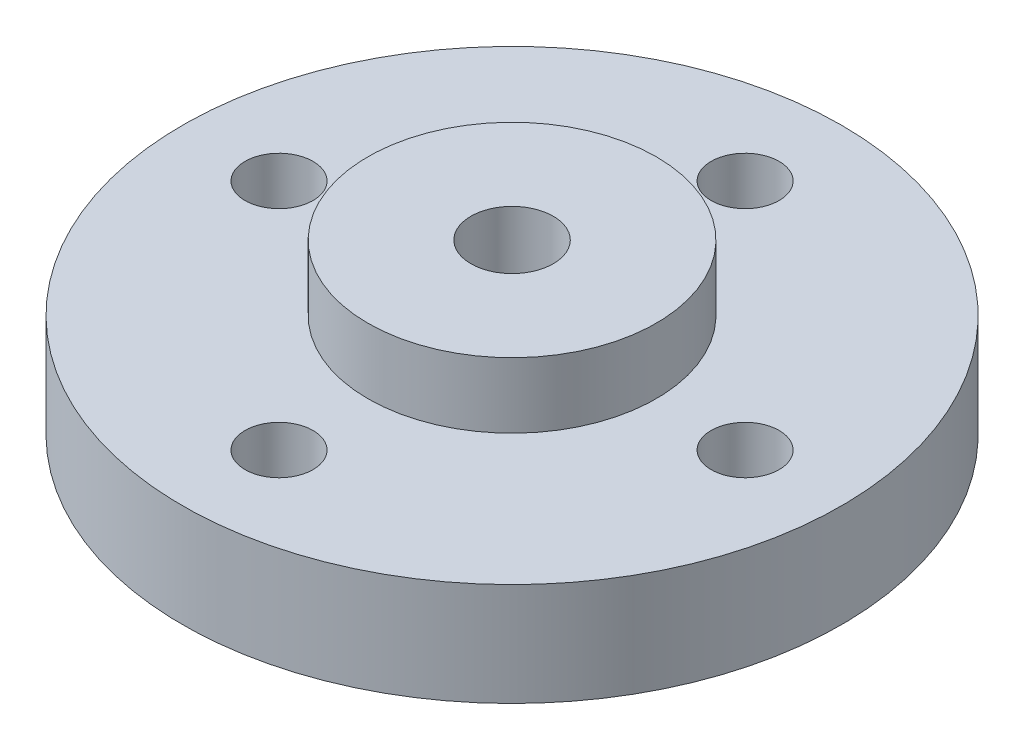
ISO-10303-21;
HEADER;
FILE_DESCRIPTION(('STEP AP214'),'2;1');
FILE_NAME('part.step','',(''),(''),'','','');
FILE_SCHEMA(('AUTOMOTIVE_DESIGN { 1 0 10303 214 1 1 1 1 }'));
ENDSEC;
DATA;
#1=APPLICATION_CONTEXT('core data for automotive mechanical design processes');
#2=APPLICATION_PROTOCOL_DEFINITION('international standard','automotive_design',2000,#1);
#3=PRODUCT_CONTEXT('',#1,'mechanical');
#4=PRODUCT('Part','Part','',(#3));
#5=PRODUCT_RELATED_PRODUCT_CATEGORY('part','',(#4));
#6=PRODUCT_DEFINITION_FORMATION('','',#4);
#7=PRODUCT_DEFINITION_CONTEXT('part definition',#1,'design');
#8=PRODUCT_DEFINITION('design','',#6,#7);
#9=PRODUCT_DEFINITION_SHAPE('','',#8);
#10=(LENGTH_UNIT() NAMED_UNIT(*) SI_UNIT(.MILLI.,.METRE.));
#11=(NAMED_UNIT(*) PLANE_ANGLE_UNIT() SI_UNIT($,.RADIAN.));
#12=(NAMED_UNIT(*) SI_UNIT($,.STERADIAN.) SOLID_ANGLE_UNIT());
#13=UNCERTAINTY_MEASURE_WITH_UNIT(LENGTH_MEASURE(1.E-05),#10,'distance_accuracy_value','');
#14=(GEOMETRIC_REPRESENTATION_CONTEXT(3) GLOBAL_UNCERTAINTY_ASSIGNED_CONTEXT((#13)) GLOBAL_UNIT_ASSIGNED_CONTEXT((#10,
#11,#12)) REPRESENTATION_CONTEXT('',''));
#15=CARTESIAN_POINT('',(0.,0.,0.));
#16=DIRECTION('',(0.,0.,1.));
#17=DIRECTION('',(1.,0.,0.));
#18=AXIS2_PLACEMENT_3D('',#15,#16,#17);
#19=CARTESIAN_POINT('',(-2.93582611882925,-5.,1.695));
#20=DIRECTION('',(0.866025403784439,0.,-0.5));
#21=DIRECTION('',(-0.5,0.,-0.866025403784439));
#22=AXIS2_PLACEMENT_3D('',#19,#20,#21);
#23=PLANE('',#22);
#24=DIRECTION('',(-0.5,0.,-0.866025403784439));
#25=VECTOR('',#24,1.);
#26=CARTESIAN_POINT('',(-2.93582611882925,0.,1.695));
#27=LINE('',#26,#25);
#28=CARTESIAN_POINT('',(-1.95721741255283,0.,3.39));
#29=VERTEX_POINT('',#28);
#30=CARTESIAN_POINT('',(-3.91443482510567,0.,0.));
#31=VERTEX_POINT('',#30);
#32=EDGE_CURVE('E138',#29,#31,#27,.T.);
#33=ORIENTED_EDGE('',*,*,#32,.F.);
#34=DIRECTION('',(0.,1.,0.));
#35=VECTOR('',#34,1.);
#36=CARTESIAN_POINT('',(-1.95721741255283,-5.,3.39));
#37=LINE('',#36,#35);
#38=CARTESIAN_POINT('',(-1.95721741255283,-5.,3.39));
#39=VERTEX_POINT('',#38);
#40=EDGE_CURVE('E12',#39,#29,#37,.T.);
#41=ORIENTED_EDGE('',*,*,#40,.F.);
#42=DIRECTION('',(-0.5,0.,-0.866025403784439));
#43=VECTOR('',#42,1.);
#44=CARTESIAN_POINT('',(-2.93582611882925,-5.,1.695));
#45=LINE('',#44,#43);
#46=CARTESIAN_POINT('',(-3.91443482510567,-5.,0.));
#47=VERTEX_POINT('',#46);
#48=EDGE_CURVE('E321',#39,#47,#45,.T.);
#49=ORIENTED_EDGE('',*,*,#48,.T.);
#50=DIRECTION('',(0.,1.,0.));
#51=VECTOR('',#50,1.);
#52=CARTESIAN_POINT('',(-3.91443482510567,-5.,0.));
#53=LINE('',#52,#51);
#54=EDGE_CURVE('E58',#47,#31,#53,.T.);
#55=ORIENTED_EDGE('',*,*,#54,.T.);
#56=EDGE_LOOP('',(#33,#41,#49,#55));
#57=FACE_BOUND('',#56,.T.);
#58=ADVANCED_FACE('F41',(#57),#23,.T.);
#59=CARTESIAN_POINT('',(0.,-5.,3.39));
#60=DIRECTION('',(0.,0.,-1.));
#61=DIRECTION('',(-1.,0.,0.));
#62=AXIS2_PLACEMENT_3D('',#59,#60,#61);
#63=PLANE('',#62);
#64=DIRECTION('',(-1.,0.,0.));
#65=VECTOR('',#64,1.);
#66=CARTESIAN_POINT('',(0.,0.,3.39));
#67=LINE('',#66,#65);
#68=CARTESIAN_POINT('',(1.95721741255283,0.,3.39));
#69=VERTEX_POINT('',#68);
#70=EDGE_CURVE('E140',#69,#29,#67,.T.);
#71=ORIENTED_EDGE('',*,*,#70,.F.);
#72=DIRECTION('',(0.,1.,0.));
#73=VECTOR('',#72,1.);
#74=CARTESIAN_POINT('',(1.95721741255283,-5.,3.39));
#75=LINE('',#74,#73);
#76=CARTESIAN_POINT('',(1.95721741255283,-5.,3.39));
#77=VERTEX_POINT('',#76);
#78=EDGE_CURVE('E50',#77,#69,#75,.T.);
#79=ORIENTED_EDGE('',*,*,#78,.F.);
#80=DIRECTION('',(-1.,0.,0.));
#81=VECTOR('',#80,1.);
#82=CARTESIAN_POINT('',(0.,-5.,3.39));
#83=LINE('',#82,#81);
#84=EDGE_CURVE('E323',#77,#39,#83,.T.);
#85=ORIENTED_EDGE('',*,*,#84,.T.);
#86=ORIENTED_EDGE('',*,*,#40,.T.);
#87=EDGE_LOOP('',(#71,#79,#85,#86));
#88=FACE_BOUND('',#87,.T.);
#89=ADVANCED_FACE('F161',(#88),#63,.T.);
#90=CARTESIAN_POINT('',(2.93582611882925,-5.,1.695));
#91=DIRECTION('',(-0.866025403784438,0.,-0.5));
#92=DIRECTION('',(-0.5,0.,0.866025403784438));
#93=AXIS2_PLACEMENT_3D('',#90,#91,#92);
#94=PLANE('',#93);
#95=DIRECTION('',(-0.5,0.,0.866025403784439));
#96=VECTOR('',#95,1.);
#97=CARTESIAN_POINT('',(2.93582611882925,0.,1.695));
#98=LINE('',#97,#96);
#99=CARTESIAN_POINT('',(3.91443482510567,0.,0.));
#100=VERTEX_POINT('',#99);
#101=EDGE_CURVE('E143',#100,#69,#98,.T.);
#102=ORIENTED_EDGE('',*,*,#101,.F.);
#103=DIRECTION('',(0.,1.,0.));
#104=VECTOR('',#103,1.);
#105=CARTESIAN_POINT('',(3.91443482510567,-5.,0.));
#106=LINE('',#105,#104);
#107=CARTESIAN_POINT('',(3.91443482510567,-5.,0.));
#108=VERTEX_POINT('',#107);
#109=EDGE_CURVE('E105',#108,#100,#106,.T.);
#110=ORIENTED_EDGE('',*,*,#109,.F.);
#111=DIRECTION('',(-0.5,0.,0.866025403784439));
#112=VECTOR('',#111,1.);
#113=CARTESIAN_POINT('',(2.93582611882925,-5.,1.695));
#114=LINE('',#113,#112);
#115=EDGE_CURVE('E115',#108,#77,#114,.T.);
#116=ORIENTED_EDGE('',*,*,#115,.T.);
#117=ORIENTED_EDGE('',*,*,#78,.T.);
#118=EDGE_LOOP('',(#102,#110,#116,#117));
#119=FACE_BOUND('',#118,.T.);
#120=ADVANCED_FACE('F158',(#119),#94,.T.);
#121=CARTESIAN_POINT('',(2.93582611882925,-5.,-1.695));
#122=DIRECTION('',(-0.866025403784439,0.,0.5));
#123=DIRECTION('',(0.5,0.,0.866025403784439));
#124=AXIS2_PLACEMENT_3D('',#121,#122,#123);
#125=PLANE('',#124);
#126=DIRECTION('',(0.5,0.,0.866025403784439));
#127=VECTOR('',#126,1.);
#128=CARTESIAN_POINT('',(2.93582611882925,0.,-1.695));
#129=LINE('',#128,#127);
#130=CARTESIAN_POINT('',(1.95721741255283,0.,-3.39));
#131=VERTEX_POINT('',#130);
#132=EDGE_CURVE('E101',#131,#100,#129,.T.);
#133=ORIENTED_EDGE('',*,*,#132,.F.);
#134=DIRECTION('',(0.,1.,0.));
#135=VECTOR('',#134,1.);
#136=CARTESIAN_POINT('',(1.95721741255283,-5.,-3.39));
#137=LINE('',#136,#135);
#138=CARTESIAN_POINT('',(1.95721741255283,-5.,-3.39));
#139=VERTEX_POINT('',#138);
#140=EDGE_CURVE('E96',#139,#131,#137,.T.);
#141=ORIENTED_EDGE('',*,*,#140,.F.);
#142=DIRECTION('',(0.5,0.,0.866025403784439));
#143=VECTOR('',#142,1.);
#144=CARTESIAN_POINT('',(2.93582611882925,-5.,-1.695));
#145=LINE('',#144,#143);
#146=EDGE_CURVE('E99',#139,#108,#145,.T.);
#147=ORIENTED_EDGE('',*,*,#146,.T.);
#148=ORIENTED_EDGE('',*,*,#109,.T.);
#149=EDGE_LOOP('',(#133,#141,#147,#148));
#150=FACE_BOUND('',#149,.T.);
#151=ADVANCED_FACE('F98',(#150),#125,.T.);
#152=CARTESIAN_POINT('',(0.,-5.,-3.39));
#153=DIRECTION('',(0.,0.,1.));
#154=DIRECTION('',(1.,0.,0.));
#155=AXIS2_PLACEMENT_3D('',#152,#153,#154);
#156=PLANE('',#155);
#157=DIRECTION('',(1.,0.,0.));
#158=VECTOR('',#157,1.);
#159=CARTESIAN_POINT('',(0.,0.,-3.39));
#160=LINE('',#159,#158);
#161=CARTESIAN_POINT('',(-1.95721741255283,0.,-3.39));
#162=VERTEX_POINT('',#161);
#163=EDGE_CURVE('E147',#162,#131,#160,.T.);
#164=ORIENTED_EDGE('',*,*,#163,.F.);
#165=DIRECTION('',(0.,1.,0.));
#166=VECTOR('',#165,1.);
#167=CARTESIAN_POINT('',(-1.95721741255283,-5.,-3.39));
#168=LINE('',#167,#166);
#169=CARTESIAN_POINT('',(-1.95721741255283,-5.,-3.39));
#170=VERTEX_POINT('',#169);
#171=EDGE_CURVE('E77',#170,#162,#168,.T.);
#172=ORIENTED_EDGE('',*,*,#171,.F.);
#173=DIRECTION('',(1.,0.,0.));
#174=VECTOR('',#173,1.);
#175=CARTESIAN_POINT('',(0.,-5.,-3.39));
#176=LINE('',#175,#174);
#177=EDGE_CURVE('E112',#170,#139,#176,.T.);
#178=ORIENTED_EDGE('',*,*,#177,.T.);
#179=ORIENTED_EDGE('',*,*,#140,.T.);
#180=EDGE_LOOP('',(#164,#172,#178,#179));
#181=FACE_BOUND('',#180,.T.);
#182=ADVANCED_FACE('F117',(#181),#156,.T.);
#183=CARTESIAN_POINT('',(0.,-5.,0.));
#184=DIRECTION('',(0.,1.,0.));
#185=DIRECTION('',(0.,0.,1.));
#186=AXIS2_PLACEMENT_3D('',#183,#184,#185);
#187=CYLINDRICAL_SURFACE('',#186,16.);
#188=CARTESIAN_POINT('',(0.,-5.,0.));
#189=DIRECTION('',(0.,-1.,0.));
#190=DIRECTION('',(0.,0.,-1.));
#191=AXIS2_PLACEMENT_3D('',#188,#189,#190);
#192=CIRCLE('',#191,16.);
#193=CARTESIAN_POINT('',(0.,-5.,-16.));
#194=VERTEX_POINT('',#193);
#195=EDGE_CURVE('E318',#194,#194,#192,.T.);
#196=ORIENTED_EDGE('',*,*,#195,.F.);
#197=EDGE_LOOP('',(#196));
#198=FACE_BOUND('',#197,.T.);
#199=CARTESIAN_POINT('',(0.,0.,0.));
#200=DIRECTION('',(0.,-1.,0.));
#201=DIRECTION('',(0.,0.,-1.));
#202=AXIS2_PLACEMENT_3D('',#199,#200,#201);
#203=CIRCLE('',#202,16.);
#204=CARTESIAN_POINT('',(0.,0.,-16.));
#205=VERTEX_POINT('',#204);
#206=EDGE_CURVE('E135',#205,#205,#203,.T.);
#207=ORIENTED_EDGE('',*,*,#206,.T.);
#208=EDGE_LOOP('',(#207));
#209=FACE_BOUND('',#208,.T.);
#210=ADVANCED_FACE('F185',(#198,#209),#187,.T.);
#211=CARTESIAN_POINT('',(-11.3137084989848,-5.,0.));
#212=DIRECTION('',(0.,1.,0.));
#213=DIRECTION('',(0.,0.,1.));
#214=AXIS2_PLACEMENT_3D('',#211,#212,#213);
#215=CYLINDRICAL_SURFACE('',#214,1.65);
#216=CARTESIAN_POINT('',(-11.3137084989848,-5.,0.));
#217=DIRECTION('',(0.,-1.,0.));
#218=DIRECTION('',(0.,0.,-1.));
#219=AXIS2_PLACEMENT_3D('',#216,#217,#218);
#220=CIRCLE('',#219,1.65);
#221=CARTESIAN_POINT('',(-11.3137084989848,-5.,-1.65));
#222=VERTEX_POINT('',#221);
#223=EDGE_CURVE('E311',#222,#222,#220,.T.);
#224=ORIENTED_EDGE('',*,*,#223,.T.);
#225=EDGE_LOOP('',(#224));
#226=FACE_BOUND('',#225,.T.);
#227=CARTESIAN_POINT('',(-11.3137084989848,0.,0.));
#228=DIRECTION('',(0.,-1.,0.));
#229=DIRECTION('',(0.,0.,-1.));
#230=AXIS2_PLACEMENT_3D('',#227,#228,#229);
#231=CIRCLE('',#230,1.65);
#232=CARTESIAN_POINT('',(-11.3137084989848,0.,-1.65));
#233=VERTEX_POINT('',#232);
#234=EDGE_CURVE('E132',#233,#233,#231,.T.);
#235=ORIENTED_EDGE('',*,*,#234,.F.);
#236=EDGE_LOOP('',(#235));
#237=FACE_BOUND('',#236,.T.);
#238=ADVANCED_FACE('F188',(#226,#237),#215,.F.);
#239=CARTESIAN_POINT('',(0.,-5.,-11.3137084989848));
#240=DIRECTION('',(0.,1.,0.));
#241=DIRECTION('',(0.,0.,1.));
#242=AXIS2_PLACEMENT_3D('',#239,#240,#241);
#243=CYLINDRICAL_SURFACE('',#242,1.65);
#244=CARTESIAN_POINT('',(0.,-5.,-11.3137084989848));
#245=DIRECTION('',(0.,-1.,0.));
#246=DIRECTION('',(0.,0.,-1.));
#247=AXIS2_PLACEMENT_3D('',#244,#245,#246);
#248=CIRCLE('',#247,1.65);
#249=CARTESIAN_POINT('',(0.,-5.,-12.9637084989848));
#250=VERTEX_POINT('',#249);
#251=EDGE_CURVE('E308',#250,#250,#248,.T.);
#252=ORIENTED_EDGE('',*,*,#251,.T.);
#253=EDGE_LOOP('',(#252));
#254=FACE_BOUND('',#253,.T.);
#255=CARTESIAN_POINT('',(0.,0.,-11.3137084989848));
#256=DIRECTION('',(0.,-1.,0.));
#257=DIRECTION('',(0.,0.,-1.));
#258=AXIS2_PLACEMENT_3D('',#255,#256,#257);
#259=CIRCLE('',#258,1.65);
#260=CARTESIAN_POINT('',(0.,0.,-12.9637084989848));
#261=VERTEX_POINT('',#260);
#262=EDGE_CURVE('E129',#261,#261,#259,.T.);
#263=ORIENTED_EDGE('',*,*,#262,.F.);
#264=EDGE_LOOP('',(#263));
#265=FACE_BOUND('',#264,.T.);
#266=ADVANCED_FACE('F192',(#254,#265),#243,.F.);
#267=CARTESIAN_POINT('',(11.3137084989848,-5.,0.));
#268=DIRECTION('',(0.,1.,0.));
#269=DIRECTION('',(0.,0.,1.));
#270=AXIS2_PLACEMENT_3D('',#267,#268,#269);
#271=CYLINDRICAL_SURFACE('',#270,1.65);
#272=CARTESIAN_POINT('',(11.3137084989848,-5.,0.));
#273=DIRECTION('',(0.,-1.,0.));
#274=DIRECTION('',(0.,0.,-1.));
#275=AXIS2_PLACEMENT_3D('',#272,#273,#274);
#276=CIRCLE('',#275,1.65);
#277=CARTESIAN_POINT('',(11.3137084989848,-5.,-1.65));
#278=VERTEX_POINT('',#277);
#279=EDGE_CURVE('E203',#278,#278,#276,.T.);
#280=ORIENTED_EDGE('',*,*,#279,.T.);
#281=EDGE_LOOP('',(#280));
#282=FACE_BOUND('',#281,.T.);
#283=CARTESIAN_POINT('',(11.3137084989848,0.,0.));
#284=DIRECTION('',(0.,-1.,0.));
#285=DIRECTION('',(0.,0.,-1.));
#286=AXIS2_PLACEMENT_3D('',#283,#284,#285);
#287=CIRCLE('',#286,1.65);
#288=CARTESIAN_POINT('',(11.3137084989848,0.,-1.65));
#289=VERTEX_POINT('',#288);
#290=EDGE_CURVE('E126',#289,#289,#287,.T.);
#291=ORIENTED_EDGE('',*,*,#290,.F.);
#292=EDGE_LOOP('',(#291));
#293=FACE_BOUND('',#292,.T.);
#294=ADVANCED_FACE('F173',(#282,#293),#271,.F.);
#295=CARTESIAN_POINT('',(0.,-5.,11.3137084989848));
#296=DIRECTION('',(0.,1.,0.));
#297=DIRECTION('',(0.,0.,1.));
#298=AXIS2_PLACEMENT_3D('',#295,#296,#297);
#299=CYLINDRICAL_SURFACE('',#298,1.65);
#300=CARTESIAN_POINT('',(0.,-5.,11.3137084989848));
#301=DIRECTION('',(0.,-1.,0.));
#302=DIRECTION('',(0.,0.,-1.));
#303=AXIS2_PLACEMENT_3D('',#300,#301,#302);
#304=CIRCLE('',#303,1.65);
#305=CARTESIAN_POINT('',(0.,-5.,9.66370849898476));
#306=VERTEX_POINT('',#305);
#307=EDGE_CURVE('E152',#306,#306,#304,.T.);
#308=ORIENTED_EDGE('',*,*,#307,.T.);
#309=EDGE_LOOP('',(#308));
#310=FACE_BOUND('',#309,.T.);
#311=CARTESIAN_POINT('',(0.,0.,11.3137084989848));
#312=DIRECTION('',(0.,-1.,0.));
#313=DIRECTION('',(0.,0.,-1.));
#314=AXIS2_PLACEMENT_3D('',#311,#312,#313);
#315=CIRCLE('',#314,1.65);
#316=CARTESIAN_POINT('',(0.,0.,9.66370849898476));
#317=VERTEX_POINT('',#316);
#318=EDGE_CURVE('E123',#317,#317,#315,.T.);
#319=ORIENTED_EDGE('',*,*,#318,.F.);
#320=EDGE_LOOP('',(#319));
#321=FACE_BOUND('',#320,.T.);
#322=ADVANCED_FACE('F43',(#310,#321),#299,.F.);
#323=CARTESIAN_POINT('',(-2.93582611882925,-5.,-1.695));
#324=DIRECTION('',(0.866025403784439,0.,0.5));
#325=DIRECTION('',(0.5,0.,-0.866025403784439));
#326=AXIS2_PLACEMENT_3D('',#323,#324,#325);
#327=PLANE('',#326);
#328=DIRECTION('',(0.5,0.,-0.866025403784439));
#329=VECTOR('',#328,1.);
#330=CARTESIAN_POINT('',(-2.93582611882925,0.,-1.695));
#331=LINE('',#330,#329);
#332=EDGE_CURVE('E149',#31,#162,#331,.T.);
#333=ORIENTED_EDGE('',*,*,#332,.F.);
#334=ORIENTED_EDGE('',*,*,#54,.F.);
#335=DIRECTION('',(0.5,0.,-0.866025403784439));
#336=VECTOR('',#335,1.);
#337=CARTESIAN_POINT('',(-2.93582611882925,-5.,-1.695));
#338=LINE('',#337,#336);
#339=EDGE_CURVE('E118',#47,#170,#338,.T.);
#340=ORIENTED_EDGE('',*,*,#339,.T.);
#341=ORIENTED_EDGE('',*,*,#171,.T.);
#342=EDGE_LOOP('',(#333,#334,#340,#341));
#343=FACE_BOUND('',#342,.T.);
#344=ADVANCED_FACE('F164',(#343),#327,.T.);
#345=CARTESIAN_POINT('',(0.,-5.,0.));
#346=DIRECTION('',(0.,-1.,0.));
#347=DIRECTION('',(0.,0.,-1.));
#348=AXIS2_PLACEMENT_3D('',#345,#346,#347);
#349=PLANE('',#348);
#350=ORIENTED_EDGE('',*,*,#307,.F.);
#351=EDGE_LOOP('',(#350));
#352=FACE_BOUND('',#351,.T.);
#353=ORIENTED_EDGE('',*,*,#279,.F.);
#354=EDGE_LOOP('',(#353));
#355=FACE_BOUND('',#354,.T.);
#356=ORIENTED_EDGE('',*,*,#251,.F.);
#357=EDGE_LOOP('',(#356));
#358=FACE_BOUND('',#357,.T.);
#359=ORIENTED_EDGE('',*,*,#223,.F.);
#360=EDGE_LOOP('',(#359));
#361=FACE_BOUND('',#360,.T.);
#362=ORIENTED_EDGE('',*,*,#195,.T.);
#363=EDGE_LOOP('',(#362));
#364=FACE_BOUND('',#363,.T.);
#365=ORIENTED_EDGE('',*,*,#48,.F.);
#366=ORIENTED_EDGE('',*,*,#84,.F.);
#367=ORIENTED_EDGE('',*,*,#115,.F.);
#368=ORIENTED_EDGE('',*,*,#146,.F.);
#369=ORIENTED_EDGE('',*,*,#177,.F.);
#370=ORIENTED_EDGE('',*,*,#339,.F.);
#371=EDGE_LOOP('',(#365,#366,#367,#368,#369,#370));
#372=FACE_BOUND('',#371,.T.);
#373=ADVANCED_FACE('F110',(#352,#355,#358,#361,#364,#372),#349,.T.);
#374=CARTESIAN_POINT('',(0.,0.,0.));
#375=DIRECTION('',(0.,-1.,0.));
#376=DIRECTION('',(0.,0.,-1.));
#377=AXIS2_PLACEMENT_3D('',#374,#375,#376);
#378=PLANE('',#377);
#379=ORIENTED_EDGE('',*,*,#318,.T.);
#380=EDGE_LOOP('',(#379));
#381=FACE_BOUND('',#380,.T.);
#382=ORIENTED_EDGE('',*,*,#290,.T.);
#383=EDGE_LOOP('',(#382));
#384=FACE_BOUND('',#383,.T.);
#385=ORIENTED_EDGE('',*,*,#262,.T.);
#386=EDGE_LOOP('',(#385));
#387=FACE_BOUND('',#386,.T.);
#388=ORIENTED_EDGE('',*,*,#234,.T.);
#389=EDGE_LOOP('',(#388));
#390=FACE_BOUND('',#389,.T.);
#391=ORIENTED_EDGE('',*,*,#206,.F.);
#392=EDGE_LOOP('',(#391));
#393=FACE_BOUND('',#392,.T.);
#394=ORIENTED_EDGE('',*,*,#32,.T.);
#395=ORIENTED_EDGE('',*,*,#332,.T.);
#396=ORIENTED_EDGE('',*,*,#163,.T.);
#397=ORIENTED_EDGE('',*,*,#132,.T.);
#398=ORIENTED_EDGE('',*,*,#101,.T.);
#399=ORIENTED_EDGE('',*,*,#70,.T.);
#400=EDGE_LOOP('',(#394,#395,#396,#397,#398,#399));
#401=FACE_BOUND('',#400,.T.);
#402=ADVANCED_FACE('F163',(#381,#384,#387,#390,#393,#401),#378,.F.);
#403=CLOSED_SHELL('',(#58,#89,#120,#151,#182,#210,#238,#266,#294,#322,#344,#373,#402));
#404=MANIFOLD_SOLID_BREP('B2',#403);
#405=CARTESIAN_POINT('',(0.,3.175,0.));
#406=DIRECTION('',(0.,1.,0.));
#407=DIRECTION('',(0.,0.,1.));
#408=AXIS2_PLACEMENT_3D('',#405,#406,#407);
#409=PLANE('',#408);
#410=CARTESIAN_POINT('',(0.,3.175,0.));
#411=DIRECTION('',(0.,1.,0.));
#412=DIRECTION('',(0.,0.,1.));
#413=AXIS2_PLACEMENT_3D('',#410,#411,#412);
#414=CIRCLE('',#413,7.);
#415=CARTESIAN_POINT('',(0.,3.175,7.));
#416=VERTEX_POINT('',#415);
#417=EDGE_CURVE('E40',#416,#416,#414,.T.);
#418=ORIENTED_EDGE('',*,*,#417,.T.);
#419=EDGE_LOOP('',(#418));
#420=FACE_BOUND('',#419,.T.);
#421=CARTESIAN_POINT('',(0.,3.175,0.));
#422=DIRECTION('',(0.,1.,0.));
#423=DIRECTION('',(0.,0.,1.));
#424=AXIS2_PLACEMENT_3D('',#421,#422,#423);
#425=CIRCLE('',#424,2.);
#426=CARTESIAN_POINT('',(0.,3.175,2.));
#427=VERTEX_POINT('',#426);
#428=EDGE_CURVE('E345',#427,#427,#425,.T.);
#429=ORIENTED_EDGE('',*,*,#428,.F.);
#430=EDGE_LOOP('',(#429));
#431=FACE_BOUND('',#430,.T.);
#432=ADVANCED_FACE('F334',(#420,#431),#409,.T.);
#433=CARTESIAN_POINT('',(0.,0.,0.));
#434=DIRECTION('',(0.,1.,0.));
#435=DIRECTION('',(0.,0.,1.));
#436=AXIS2_PLACEMENT_3D('',#433,#434,#435);
#437=PLANE('',#436);
#438=CARTESIAN_POINT('',(0.,0.,0.));
#439=DIRECTION('',(0.,1.,0.));
#440=DIRECTION('',(0.,0.,1.));
#441=AXIS2_PLACEMENT_3D('',#438,#439,#440);
#442=CIRCLE('',#441,7.);
#443=CARTESIAN_POINT('',(0.,0.,7.));
#444=VERTEX_POINT('',#443);
#445=EDGE_CURVE('E338',#444,#444,#442,.T.);
#446=ORIENTED_EDGE('',*,*,#445,.F.);
#447=EDGE_LOOP('',(#446));
#448=FACE_BOUND('',#447,.T.);
#449=CARTESIAN_POINT('',(0.,0.,0.));
#450=DIRECTION('',(0.,1.,0.));
#451=DIRECTION('',(0.,0.,1.));
#452=AXIS2_PLACEMENT_3D('',#449,#450,#451);
#453=CIRCLE('',#452,2.);
#454=CARTESIAN_POINT('',(0.,0.,2.));
#455=VERTEX_POINT('',#454);
#456=EDGE_CURVE('E347',#455,#455,#453,.T.);
#457=ORIENTED_EDGE('',*,*,#456,.T.);
#458=EDGE_LOOP('',(#457));
#459=FACE_BOUND('',#458,.T.);
#460=ADVANCED_FACE('F357',(#448,#459),#437,.F.);
#461=CARTESIAN_POINT('',(0.,3.175,0.));
#462=DIRECTION('',(0.,-1.,0.));
#463=DIRECTION('',(0.,0.,-1.));
#464=AXIS2_PLACEMENT_3D('',#461,#462,#463);
#465=CYLINDRICAL_SURFACE('',#464,7.);
#466=ORIENTED_EDGE('',*,*,#417,.F.);
#467=EDGE_LOOP('',(#466));
#468=FACE_BOUND('',#467,.T.);
#469=ORIENTED_EDGE('',*,*,#445,.T.);
#470=EDGE_LOOP('',(#469));
#471=FACE_BOUND('',#470,.T.);
#472=ADVANCED_FACE('F336',(#468,#471),#465,.T.);
#473=CARTESIAN_POINT('',(0.,3.175,0.));
#474=DIRECTION('',(0.,-1.,0.));
#475=DIRECTION('',(0.,0.,-1.));
#476=AXIS2_PLACEMENT_3D('',#473,#474,#475);
#477=CYLINDRICAL_SURFACE('',#476,2.);
#478=ORIENTED_EDGE('',*,*,#428,.T.);
#479=EDGE_LOOP('',(#478));
#480=FACE_BOUND('',#479,.T.);
#481=ORIENTED_EDGE('',*,*,#456,.F.);
#482=EDGE_LOOP('',(#481));
#483=FACE_BOUND('',#482,.T.);
#484=ADVANCED_FACE('F353',(#480,#483),#477,.F.);
#485=CLOSED_SHELL('',(#432,#460,#472,#484));
#486=MANIFOLD_SOLID_BREP('B6',#485);
#487=ADVANCED_BREP_SHAPE_REPRESENTATION('',(#18,#404,#486),#14);
#488=SHAPE_DEFINITION_REPRESENTATION(#9,#487);
ENDSEC;
END-ISO-10303-21;
